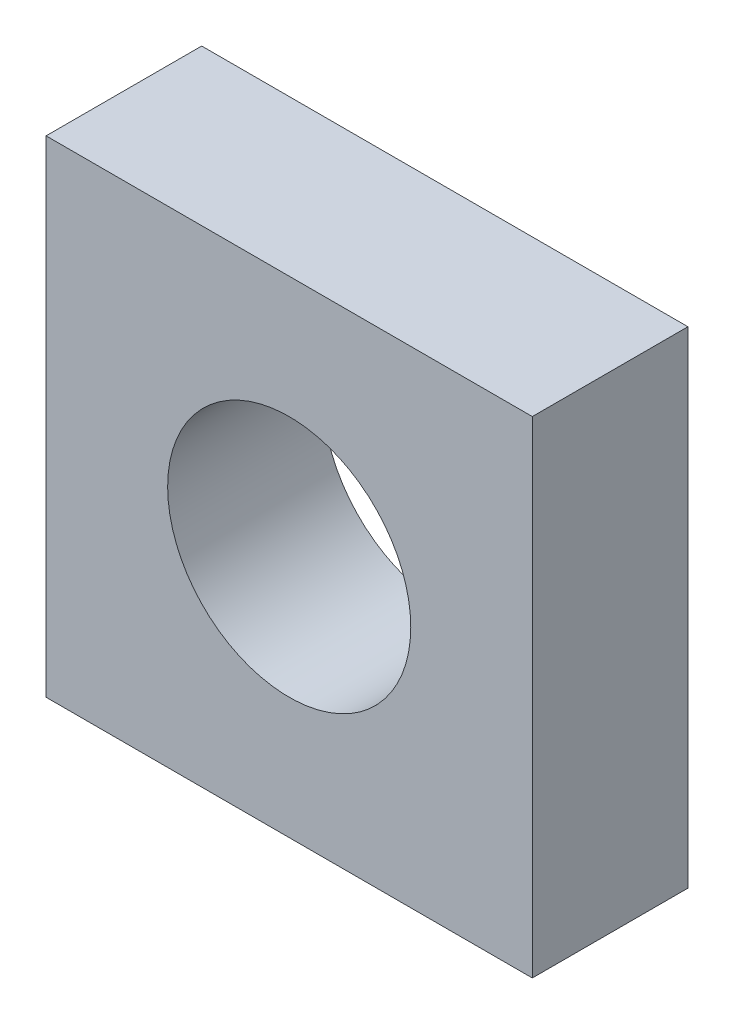
ISO-10303-21;
HEADER;
FILE_DESCRIPTION(('STEP AP214'),'2;1');
FILE_NAME('part.step','',(''),(''),'','','');
FILE_SCHEMA(('AUTOMOTIVE_DESIGN { 1 0 10303 214 1 1 1 1 }'));
ENDSEC;
DATA;
#1=APPLICATION_CONTEXT('core data for automotive mechanical design processes');
#2=APPLICATION_PROTOCOL_DEFINITION('international standard','automotive_design',2000,#1);
#3=PRODUCT_CONTEXT('',#1,'mechanical');
#4=PRODUCT('Part','Part','',(#3));
#5=PRODUCT_RELATED_PRODUCT_CATEGORY('part','',(#4));
#6=PRODUCT_DEFINITION_FORMATION('','',#4);
#7=PRODUCT_DEFINITION_CONTEXT('part definition',#1,'design');
#8=PRODUCT_DEFINITION('design','',#6,#7);
#9=PRODUCT_DEFINITION_SHAPE('','',#8);
#10=(LENGTH_UNIT() NAMED_UNIT(*) SI_UNIT(.MILLI.,.METRE.));
#11=(NAMED_UNIT(*) PLANE_ANGLE_UNIT() SI_UNIT($,.RADIAN.));
#12=(NAMED_UNIT(*) SI_UNIT($,.STERADIAN.) SOLID_ANGLE_UNIT());
#13=UNCERTAINTY_MEASURE_WITH_UNIT(LENGTH_MEASURE(1.E-05),#10,'distance_accuracy_value','');
#14=(GEOMETRIC_REPRESENTATION_CONTEXT(3) GLOBAL_UNCERTAINTY_ASSIGNED_CONTEXT((#13)) GLOBAL_UNIT_ASSIGNED_CONTEXT((#10,
#11,#12)) REPRESENTATION_CONTEXT('',''));
#15=CARTESIAN_POINT('',(0.,0.,0.));
#16=DIRECTION('',(0.,0.,1.));
#17=DIRECTION('',(1.,0.,0.));
#18=AXIS2_PLACEMENT_3D('',#15,#16,#17);
#19=CARTESIAN_POINT('',(2.5,-2.5,1.6));
#20=DIRECTION('',(-1.,0.,0.));
#21=DIRECTION('',(0.,0.,1.));
#22=AXIS2_PLACEMENT_3D('',#19,#20,#21);
#23=PLANE('',#22);
#24=DIRECTION('',(0.,1.,0.));
#25=VECTOR('',#24,1.);
#26=CARTESIAN_POINT('',(2.5,-2.5,0.));
#27=LINE('',#26,#25);
#28=CARTESIAN_POINT('',(2.5,-2.5,0.));
#29=VERTEX_POINT('',#28);
#30=CARTESIAN_POINT('',(2.5,2.5,0.));
#31=VERTEX_POINT('',#30);
#32=EDGE_CURVE('E98',#29,#31,#27,.T.);
#33=ORIENTED_EDGE('',*,*,#32,.T.);
#34=DIRECTION('',(0.,0.,-1.));
#35=VECTOR('',#34,1.);
#36=CARTESIAN_POINT('',(2.5,2.5,1.6));
#37=LINE('',#36,#35);
#38=CARTESIAN_POINT('',(2.5,2.5,1.6));
#39=VERTEX_POINT('',#38);
#40=EDGE_CURVE('E11',#39,#31,#37,.T.);
#41=ORIENTED_EDGE('',*,*,#40,.F.);
#42=DIRECTION('',(0.,1.,0.));
#43=VECTOR('',#42,1.);
#44=CARTESIAN_POINT('',(2.5,-2.5,1.6));
#45=LINE('',#44,#43);
#46=CARTESIAN_POINT('',(2.5,-2.5,1.6));
#47=VERTEX_POINT('',#46);
#48=EDGE_CURVE('E86',#47,#39,#45,.T.);
#49=ORIENTED_EDGE('',*,*,#48,.F.);
#50=DIRECTION('',(0.,0.,-1.));
#51=VECTOR('',#50,1.);
#52=CARTESIAN_POINT('',(2.5,-2.5,1.6));
#53=LINE('',#52,#51);
#54=EDGE_CURVE('E94',#47,#29,#53,.T.);
#55=ORIENTED_EDGE('',*,*,#54,.T.);
#56=EDGE_LOOP('',(#33,#41,#49,#55));
#57=FACE_BOUND('',#56,.T.);
#58=ADVANCED_FACE('F35',(#57),#23,.F.);
#59=CARTESIAN_POINT('',(-2.5,2.5,1.6));
#60=DIRECTION('',(0.,-1.,0.));
#61=DIRECTION('',(0.,0.,-1.));
#62=AXIS2_PLACEMENT_3D('',#59,#60,#61);
#63=PLANE('',#62);
#64=DIRECTION('',(-1.,0.,0.));
#65=VECTOR('',#64,1.);
#66=CARTESIAN_POINT('',(-2.5,2.5,0.));
#67=LINE('',#66,#65);
#68=CARTESIAN_POINT('',(-2.5,2.5,0.));
#69=VERTEX_POINT('',#68);
#70=EDGE_CURVE('E90',#31,#69,#67,.T.);
#71=ORIENTED_EDGE('',*,*,#70,.T.);
#72=DIRECTION('',(0.,0.,-1.));
#73=VECTOR('',#72,1.);
#74=CARTESIAN_POINT('',(-2.5,2.5,1.6));
#75=LINE('',#74,#73);
#76=CARTESIAN_POINT('',(-2.5,2.5,1.6));
#77=VERTEX_POINT('',#76);
#78=EDGE_CURVE('E43',#77,#69,#75,.T.);
#79=ORIENTED_EDGE('',*,*,#78,.F.);
#80=DIRECTION('',(-1.,0.,0.));
#81=VECTOR('',#80,1.);
#82=CARTESIAN_POINT('',(-2.5,2.5,1.6));
#83=LINE('',#82,#81);
#84=EDGE_CURVE('E81',#39,#77,#83,.T.);
#85=ORIENTED_EDGE('',*,*,#84,.F.);
#86=ORIENTED_EDGE('',*,*,#40,.T.);
#87=EDGE_LOOP('',(#71,#79,#85,#86));
#88=FACE_BOUND('',#87,.T.);
#89=ADVANCED_FACE('F89',(#88),#63,.F.);
#90=CARTESIAN_POINT('',(-2.5,-2.5,1.6));
#91=DIRECTION('',(1.,0.,0.));
#92=DIRECTION('',(0.,0.,-1.));
#93=AXIS2_PLACEMENT_3D('',#90,#91,#92);
#94=PLANE('',#93);
#95=DIRECTION('',(0.,-1.,0.));
#96=VECTOR('',#95,1.);
#97=CARTESIAN_POINT('',(-2.5,-2.5,0.));
#98=LINE('',#97,#96);
#99=CARTESIAN_POINT('',(-2.5,-2.5,0.));
#100=VERTEX_POINT('',#99);
#101=EDGE_CURVE('E68',#69,#100,#98,.T.);
#102=ORIENTED_EDGE('',*,*,#101,.T.);
#103=DIRECTION('',(0.,0.,-1.));
#104=VECTOR('',#103,1.);
#105=CARTESIAN_POINT('',(-2.5,-2.5,1.6));
#106=LINE('',#105,#104);
#107=CARTESIAN_POINT('',(-2.5,-2.5,1.6));
#108=VERTEX_POINT('',#107);
#109=EDGE_CURVE('E91',#108,#100,#106,.T.);
#110=ORIENTED_EDGE('',*,*,#109,.F.);
#111=DIRECTION('',(0.,-1.,0.));
#112=VECTOR('',#111,1.);
#113=CARTESIAN_POINT('',(-2.5,-2.5,1.6));
#114=LINE('',#113,#112);
#115=EDGE_CURVE('E84',#77,#108,#114,.T.);
#116=ORIENTED_EDGE('',*,*,#115,.F.);
#117=ORIENTED_EDGE('',*,*,#78,.T.);
#118=EDGE_LOOP('',(#102,#110,#116,#117));
#119=FACE_BOUND('',#118,.T.);
#120=ADVANCED_FACE('F92',(#119),#94,.F.);
#121=CARTESIAN_POINT('',(-2.5,-2.5,1.6));
#122=DIRECTION('',(0.,1.,0.));
#123=DIRECTION('',(0.,0.,1.));
#124=AXIS2_PLACEMENT_3D('',#121,#122,#123);
#125=PLANE('',#124);
#126=DIRECTION('',(1.,0.,0.));
#127=VECTOR('',#126,1.);
#128=CARTESIAN_POINT('',(-2.5,-2.5,0.));
#129=LINE('',#128,#127);
#130=EDGE_CURVE('E74',#100,#29,#129,.T.);
#131=ORIENTED_EDGE('',*,*,#130,.T.);
#132=ORIENTED_EDGE('',*,*,#54,.F.);
#133=DIRECTION('',(1.,0.,0.));
#134=VECTOR('',#133,1.);
#135=CARTESIAN_POINT('',(-2.5,-2.5,1.6));
#136=LINE('',#135,#134);
#137=EDGE_CURVE('E51',#108,#47,#136,.T.);
#138=ORIENTED_EDGE('',*,*,#137,.F.);
#139=ORIENTED_EDGE('',*,*,#109,.T.);
#140=EDGE_LOOP('',(#131,#132,#138,#139));
#141=FACE_BOUND('',#140,.T.);
#142=ADVANCED_FACE('F106',(#141),#125,.F.);
#143=CARTESIAN_POINT('',(0.,0.,1.6));
#144=DIRECTION('',(0.,0.,-1.));
#145=DIRECTION('',(-1.,0.,0.));
#146=AXIS2_PLACEMENT_3D('',#143,#144,#145);
#147=PLANE('',#146);
#148=CARTESIAN_POINT('',(0.,0.,1.6));
#149=DIRECTION('',(0.,0.,1.));
#150=DIRECTION('',(1.,0.,0.));
#151=AXIS2_PLACEMENT_3D('',#148,#149,#150);
#152=CIRCLE('',#151,1.25);
#153=CARTESIAN_POINT('',(1.25,0.,1.6));
#154=VERTEX_POINT('',#153);
#155=EDGE_CURVE('E101',#154,#154,#152,.T.);
#156=ORIENTED_EDGE('',*,*,#155,.F.);
#157=EDGE_LOOP('',(#156));
#158=FACE_BOUND('',#157,.T.);
#159=ORIENTED_EDGE('',*,*,#48,.T.);
#160=ORIENTED_EDGE('',*,*,#84,.T.);
#161=ORIENTED_EDGE('',*,*,#115,.T.);
#162=ORIENTED_EDGE('',*,*,#137,.T.);
#163=EDGE_LOOP('',(#159,#160,#161,#162));
#164=FACE_BOUND('',#163,.T.);
#165=ADVANCED_FACE('F82',(#158,#164),#147,.F.);
#166=CARTESIAN_POINT('',(0.,0.,0.));
#167=DIRECTION('',(0.,0.,-1.));
#168=DIRECTION('',(-1.,0.,0.));
#169=AXIS2_PLACEMENT_3D('',#166,#167,#168);
#170=PLANE('',#169);
#171=CARTESIAN_POINT('',(0.,0.,0.));
#172=DIRECTION('',(0.,0.,1.));
#173=DIRECTION('',(1.,0.,0.));
#174=AXIS2_PLACEMENT_3D('',#171,#172,#173);
#175=CIRCLE('',#174,1.25);
#176=CARTESIAN_POINT('',(1.25,0.,0.));
#177=VERTEX_POINT('',#176);
#178=EDGE_CURVE('E112',#177,#177,#175,.T.);
#179=ORIENTED_EDGE('',*,*,#178,.T.);
#180=EDGE_LOOP('',(#179));
#181=FACE_BOUND('',#180,.T.);
#182=ORIENTED_EDGE('',*,*,#32,.F.);
#183=ORIENTED_EDGE('',*,*,#130,.F.);
#184=ORIENTED_EDGE('',*,*,#101,.F.);
#185=ORIENTED_EDGE('',*,*,#70,.F.);
#186=EDGE_LOOP('',(#182,#183,#184,#185));
#187=FACE_BOUND('',#186,.T.);
#188=ADVANCED_FACE('F109',(#181,#187),#170,.T.);
#189=CARTESIAN_POINT('',(0.,0.,1.6));
#190=DIRECTION('',(0.,0.,-1.));
#191=DIRECTION('',(-1.,0.,0.));
#192=AXIS2_PLACEMENT_3D('',#189,#190,#191);
#193=CYLINDRICAL_SURFACE('',#192,1.25);
#194=ORIENTED_EDGE('',*,*,#155,.T.);
#195=EDGE_LOOP('',(#194));
#196=FACE_BOUND('',#195,.T.);
#197=ORIENTED_EDGE('',*,*,#178,.F.);
#198=EDGE_LOOP('',(#197));
#199=FACE_BOUND('',#198,.T.);
#200=ADVANCED_FACE('F118',(#196,#199),#193,.F.);
#201=CLOSED_SHELL('',(#58,#89,#120,#142,#165,#188,#200));
#202=MANIFOLD_SOLID_BREP('B2',#201);
#203=ADVANCED_BREP_SHAPE_REPRESENTATION('',(#18,#202),#14);
#204=SHAPE_DEFINITION_REPRESENTATION(#9,#203);
ENDSEC;
END-ISO-10303-21;
